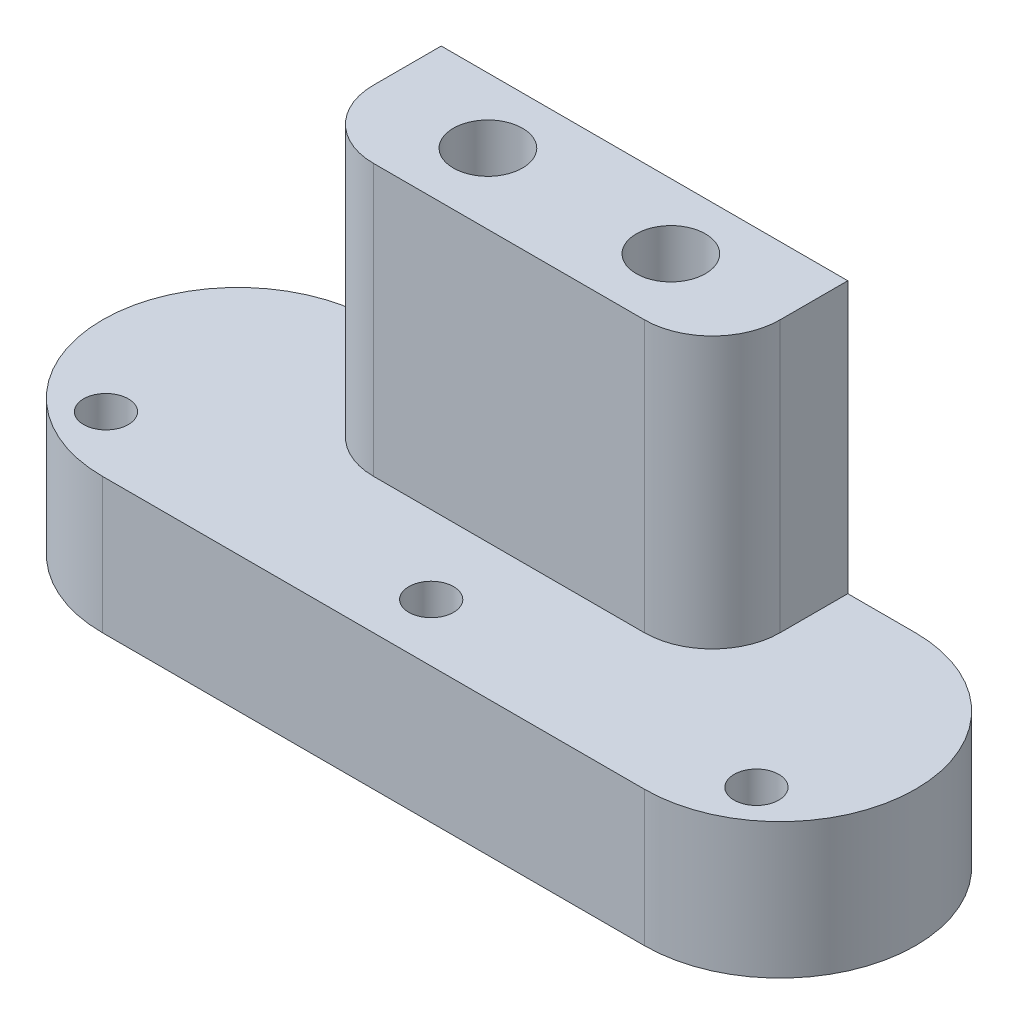
ISO-10303-21;
HEADER;
FILE_DESCRIPTION(('STEP AP214'),'2;1');
FILE_NAME('part.step','',(''),(''),'','','');
FILE_SCHEMA(('AUTOMOTIVE_DESIGN { 1 0 10303 214 1 1 1 1 }'));
ENDSEC;
DATA;
#1=APPLICATION_CONTEXT('core data for automotive mechanical design processes');
#2=APPLICATION_PROTOCOL_DEFINITION('international standard','automotive_design',2000,#1);
#3=PRODUCT_CONTEXT('',#1,'mechanical');
#4=PRODUCT('Part','Part','',(#3));
#5=PRODUCT_RELATED_PRODUCT_CATEGORY('part','',(#4));
#6=PRODUCT_DEFINITION_FORMATION('','',#4);
#7=PRODUCT_DEFINITION_CONTEXT('part definition',#1,'design');
#8=PRODUCT_DEFINITION('design','',#6,#7);
#9=PRODUCT_DEFINITION_SHAPE('','',#8);
#10=(LENGTH_UNIT() NAMED_UNIT(*) SI_UNIT(.MILLI.,.METRE.));
#11=(NAMED_UNIT(*) PLANE_ANGLE_UNIT() SI_UNIT($,.RADIAN.));
#12=(NAMED_UNIT(*) SI_UNIT($,.STERADIAN.) SOLID_ANGLE_UNIT());
#13=UNCERTAINTY_MEASURE_WITH_UNIT(LENGTH_MEASURE(1.E-05),#10,'distance_accuracy_value','');
#14=(GEOMETRIC_REPRESENTATION_CONTEXT(3) GLOBAL_UNCERTAINTY_ASSIGNED_CONTEXT((#13)) GLOBAL_UNIT_ASSIGNED_CONTEXT((#10,
#11,#12)) REPRESENTATION_CONTEXT('',''));
#15=CARTESIAN_POINT('',(0.,0.,0.));
#16=DIRECTION('',(0.,0.,1.));
#17=DIRECTION('',(1.,0.,0.));
#18=AXIS2_PLACEMENT_3D('',#15,#16,#17);
#19=CARTESIAN_POINT('',(-19.9999999999999,10.,0.));
#20=DIRECTION('',(0.,1.,0.));
#21=DIRECTION('',(0.,0.,1.));
#22=AXIS2_PLACEMENT_3D('',#19,#20,#21);
#23=PLANE('',#22);
#24=CARTESIAN_POINT('',(0.,10.,5.74115680757579));
#25=DIRECTION('',(0.,1.,0.));
#26=DIRECTION('',(0.,0.,1.));
#27=AXIS2_PLACEMENT_3D('',#24,#25,#26);
#28=CIRCLE('',#27,1.65);
#29=CARTESIAN_POINT('',(0.,10.,7.39115680757579));
#30=VERTEX_POINT('',#29);
#31=EDGE_CURVE('E157',#30,#30,#28,.T.);
#32=ORIENTED_EDGE('',*,*,#31,.F.);
#33=EDGE_LOOP('',(#32));
#34=FACE_BOUND('',#33,.T.);
#35=CARTESIAN_POINT('',(24.,10.,5.74115680757579));
#36=DIRECTION('',(0.,1.,0.));
#37=DIRECTION('',(0.,0.,1.));
#38=AXIS2_PLACEMENT_3D('',#35,#36,#37);
#39=CIRCLE('',#38,1.65);
#40=CARTESIAN_POINT('',(24.,10.,7.39115680757579));
#41=VERTEX_POINT('',#40);
#42=EDGE_CURVE('E165',#41,#41,#39,.T.);
#43=ORIENTED_EDGE('',*,*,#42,.F.);
#44=EDGE_LOOP('',(#43));
#45=FACE_BOUND('',#44,.T.);
#46=CARTESIAN_POINT('',(-24.,10.,5.74115680757579));
#47=DIRECTION('',(0.,1.,0.));
#48=DIRECTION('',(0.,0.,1.));
#49=AXIS2_PLACEMENT_3D('',#46,#47,#48);
#50=CIRCLE('',#49,1.65);
#51=CARTESIAN_POINT('',(-24.,10.,7.39115680757579));
#52=VERTEX_POINT('',#51);
#53=EDGE_CURVE('E171',#52,#52,#50,.T.);
#54=ORIENTED_EDGE('',*,*,#53,.F.);
#55=EDGE_LOOP('',(#54));
#56=FACE_BOUND('',#55,.T.);
#57=DIRECTION('',(1.,0.,0.));
#58=VECTOR('',#57,1.);
#59=CARTESIAN_POINT('',(-15.,10.,0.));
#60=LINE('',#59,#58);
#61=CARTESIAN_POINT('',(-10.,10.,0.));
#62=VERTEX_POINT('',#61);
#63=CARTESIAN_POINT('',(10.,10.,0.));
#64=VERTEX_POINT('',#63);
#65=EDGE_CURVE('E141',#62,#64,#60,.T.);
#66=ORIENTED_EDGE('',*,*,#65,.F.);
#67=CARTESIAN_POINT('',(-10.,10.,-5.));
#68=DIRECTION('',(0.,1.,0.));
#69=DIRECTION('',(0.,0.,1.));
#70=AXIS2_PLACEMENT_3D('',#67,#68,#69);
#71=CIRCLE('',#70,5.);
#72=CARTESIAN_POINT('',(-15.,10.,-5.));
#73=VERTEX_POINT('',#72);
#74=EDGE_CURVE('E43',#62,#73,#71,.F.);
#75=ORIENTED_EDGE('',*,*,#74,.T.);
#76=DIRECTION('',(0.,0.,-1.));
#77=VECTOR('',#76,1.);
#78=CARTESIAN_POINT('',(-15.,10.,0.));
#79=LINE('',#78,#77);
#80=CARTESIAN_POINT('',(-15.,10.,-10.));
#81=VERTEX_POINT('',#80);
#82=EDGE_CURVE('E137',#73,#81,#79,.T.);
#83=ORIENTED_EDGE('',*,*,#82,.T.);
#84=DIRECTION('',(-1.,0.,0.));
#85=VECTOR('',#84,1.);
#86=CARTESIAN_POINT('',(-19.9999999999999,10.,-10.));
#87=LINE('',#86,#85);
#88=CARTESIAN_POINT('',(-19.9999999999999,10.,-10.));
#89=VERTEX_POINT('',#88);
#90=EDGE_CURVE('E186',#81,#89,#87,.T.);
#91=ORIENTED_EDGE('',*,*,#90,.T.);
#92=CARTESIAN_POINT('',(-19.9999999999999,10.,0.));
#93=DIRECTION('',(0.,1.,0.));
#94=DIRECTION('',(0.,0.,1.));
#95=AXIS2_PLACEMENT_3D('',#92,#93,#94);
#96=CIRCLE('',#95,10.);
#97=CARTESIAN_POINT('',(-19.9999999999999,10.,10.));
#98=VERTEX_POINT('',#97);
#99=EDGE_CURVE('E178',#89,#98,#96,.T.);
#100=ORIENTED_EDGE('',*,*,#99,.T.);
#101=DIRECTION('',(1.,0.,0.));
#102=VECTOR('',#101,1.);
#103=CARTESIAN_POINT('',(-19.9999999999999,10.,10.));
#104=LINE('',#103,#102);
#105=CARTESIAN_POINT('',(20.,10.,10.));
#106=VERTEX_POINT('',#105);
#107=EDGE_CURVE('E181',#98,#106,#104,.T.);
#108=ORIENTED_EDGE('',*,*,#107,.T.);
#109=CARTESIAN_POINT('',(20.,10.,0.));
#110=DIRECTION('',(0.,1.,0.));
#111=DIRECTION('',(0.,0.,1.));
#112=AXIS2_PLACEMENT_3D('',#109,#110,#111);
#113=CIRCLE('',#112,10.);
#114=CARTESIAN_POINT('',(20.,10.,-10.));
#115=VERTEX_POINT('',#114);
#116=EDGE_CURVE('E184',#106,#115,#113,.T.);
#117=ORIENTED_EDGE('',*,*,#116,.T.);
#118=CARTESIAN_POINT('',(15.,10.,-10.));
#119=VERTEX_POINT('',#118);
#120=EDGE_CURVE('E187',#115,#119,#87,.T.);
#121=ORIENTED_EDGE('',*,*,#120,.T.);
#122=DIRECTION('',(0.,0.,-1.));
#123=VECTOR('',#122,1.);
#124=CARTESIAN_POINT('',(15.,10.,0.));
#125=LINE('',#124,#123);
#126=CARTESIAN_POINT('',(15.,10.,-5.));
#127=VERTEX_POINT('',#126);
#128=EDGE_CURVE('E150',#127,#119,#125,.T.);
#129=ORIENTED_EDGE('',*,*,#128,.F.);
#130=CARTESIAN_POINT('',(10.,10.,-5.));
#131=DIRECTION('',(0.,1.,0.));
#132=DIRECTION('',(0.,0.,1.));
#133=AXIS2_PLACEMENT_3D('',#130,#131,#132);
#134=CIRCLE('',#133,5.);
#135=EDGE_CURVE('E11',#127,#64,#134,.F.);
#136=ORIENTED_EDGE('',*,*,#135,.T.);
#137=EDGE_LOOP('',(#66,#75,#83,#91,#100,#108,#117,#121,#129,#136));
#138=FACE_BOUND('',#137,.T.);
#139=ADVANCED_FACE('F35',(#34,#45,#56,#138),#23,.T.);
#140=CARTESIAN_POINT('',(-19.9999999999999,10.,0.));
#141=DIRECTION('',(0.,-1.,0.));
#142=DIRECTION('',(0.,0.,-1.));
#143=AXIS2_PLACEMENT_3D('',#140,#141,#142);
#144=CYLINDRICAL_SURFACE('',#143,10.);
#145=CARTESIAN_POINT('',(-19.9999999999999,0.,0.));
#146=DIRECTION('',(0.,1.,0.));
#147=DIRECTION('',(0.,0.,1.));
#148=AXIS2_PLACEMENT_3D('',#145,#146,#147);
#149=CIRCLE('',#148,10.);
#150=CARTESIAN_POINT('',(-19.9999999999999,0.,-10.));
#151=VERTEX_POINT('',#150);
#152=CARTESIAN_POINT('',(-19.9999999999999,0.,10.));
#153=VERTEX_POINT('',#152);
#154=EDGE_CURVE('E177',#151,#153,#149,.T.);
#155=ORIENTED_EDGE('',*,*,#154,.T.);
#156=DIRECTION('',(0.,-1.,0.));
#157=VECTOR('',#156,1.);
#158=CARTESIAN_POINT('',(-19.9999999999999,10.,10.));
#159=LINE('',#158,#157);
#160=EDGE_CURVE('E206',#98,#153,#159,.T.);
#161=ORIENTED_EDGE('',*,*,#160,.F.);
#162=ORIENTED_EDGE('',*,*,#99,.F.);
#163=DIRECTION('',(0.,-1.,0.));
#164=VECTOR('',#163,1.);
#165=CARTESIAN_POINT('',(-19.9999999999999,10.,-10.));
#166=LINE('',#165,#164);
#167=EDGE_CURVE('E190',#89,#151,#166,.T.);
#168=ORIENTED_EDGE('',*,*,#167,.T.);
#169=EDGE_LOOP('',(#155,#161,#162,#168));
#170=FACE_BOUND('',#169,.T.);
#171=ADVANCED_FACE('F252',(#170),#144,.T.);
#172=CARTESIAN_POINT('',(-19.9999999999999,10.,10.));
#173=DIRECTION('',(0.,0.,-1.));
#174=DIRECTION('',(-1.,0.,0.));
#175=AXIS2_PLACEMENT_3D('',#172,#173,#174);
#176=PLANE('',#175);
#177=DIRECTION('',(1.,0.,0.));
#178=VECTOR('',#177,1.);
#179=CARTESIAN_POINT('',(-19.9999999999999,0.,10.));
#180=LINE('',#179,#178);
#181=CARTESIAN_POINT('',(20.,0.,10.));
#182=VERTEX_POINT('',#181);
#183=EDGE_CURVE('E193',#153,#182,#180,.T.);
#184=ORIENTED_EDGE('',*,*,#183,.T.);
#185=DIRECTION('',(0.,-1.,0.));
#186=VECTOR('',#185,1.);
#187=CARTESIAN_POINT('',(20.,10.,10.));
#188=LINE('',#187,#186);
#189=EDGE_CURVE('E203',#106,#182,#188,.T.);
#190=ORIENTED_EDGE('',*,*,#189,.F.);
#191=ORIENTED_EDGE('',*,*,#107,.F.);
#192=ORIENTED_EDGE('',*,*,#160,.T.);
#193=EDGE_LOOP('',(#184,#190,#191,#192));
#194=FACE_BOUND('',#193,.T.);
#195=ADVANCED_FACE('F255',(#194),#176,.F.);
#196=CARTESIAN_POINT('',(20.,10.,0.));
#197=DIRECTION('',(0.,-1.,0.));
#198=DIRECTION('',(0.,0.,-1.));
#199=AXIS2_PLACEMENT_3D('',#196,#197,#198);
#200=CYLINDRICAL_SURFACE('',#199,10.);
#201=CARTESIAN_POINT('',(20.,0.,0.));
#202=DIRECTION('',(0.,1.,0.));
#203=DIRECTION('',(0.,0.,1.));
#204=AXIS2_PLACEMENT_3D('',#201,#202,#203);
#205=CIRCLE('',#204,10.);
#206=CARTESIAN_POINT('',(20.,0.,-10.));
#207=VERTEX_POINT('',#206);
#208=EDGE_CURVE('E195',#182,#207,#205,.T.);
#209=ORIENTED_EDGE('',*,*,#208,.T.);
#210=DIRECTION('',(0.,-1.,0.));
#211=VECTOR('',#210,1.);
#212=CARTESIAN_POINT('',(20.,10.,-10.));
#213=LINE('',#212,#211);
#214=EDGE_CURVE('E200',#115,#207,#213,.T.);
#215=ORIENTED_EDGE('',*,*,#214,.F.);
#216=ORIENTED_EDGE('',*,*,#116,.F.);
#217=ORIENTED_EDGE('',*,*,#189,.T.);
#218=EDGE_LOOP('',(#209,#215,#216,#217));
#219=FACE_BOUND('',#218,.T.);
#220=ADVANCED_FACE('F258',(#219),#200,.T.);
#221=CARTESIAN_POINT('',(-19.9999999999999,10.,-10.));
#222=DIRECTION('',(0.,0.,1.));
#223=DIRECTION('',(1.,0.,0.));
#224=AXIS2_PLACEMENT_3D('',#221,#222,#223);
#225=PLANE('',#224);
#226=DIRECTION('',(-1.,0.,0.));
#227=VECTOR('',#226,1.);
#228=CARTESIAN_POINT('',(-19.9999999999999,0.,-10.));
#229=LINE('',#228,#227);
#230=EDGE_CURVE('E182',#207,#151,#229,.T.);
#231=ORIENTED_EDGE('',*,*,#230,.T.);
#232=ORIENTED_EDGE('',*,*,#167,.F.);
#233=ORIENTED_EDGE('',*,*,#90,.F.);
#234=DIRECTION('',(0.,-1.,0.));
#235=VECTOR('',#234,1.);
#236=CARTESIAN_POINT('',(-15.,30.,-10.));
#237=LINE('',#236,#235);
#238=CARTESIAN_POINT('',(-15.,30.,-10.));
#239=VERTEX_POINT('',#238);
#240=EDGE_CURVE('E148',#239,#81,#237,.T.);
#241=ORIENTED_EDGE('',*,*,#240,.F.);
#242=DIRECTION('',(1.,0.,0.));
#243=VECTOR('',#242,1.);
#244=CARTESIAN_POINT('',(-15.,30.,-10.));
#245=LINE('',#244,#243);
#246=CARTESIAN_POINT('',(15.,30.,-10.));
#247=VERTEX_POINT('',#246);
#248=EDGE_CURVE('E140',#239,#247,#245,.T.);
#249=ORIENTED_EDGE('',*,*,#248,.T.);
#250=DIRECTION('',(0.,-1.,0.));
#251=VECTOR('',#250,1.);
#252=CARTESIAN_POINT('',(15.,30.,-10.));
#253=LINE('',#252,#251);
#254=EDGE_CURVE('E154',#247,#119,#253,.T.);
#255=ORIENTED_EDGE('',*,*,#254,.T.);
#256=ORIENTED_EDGE('',*,*,#120,.F.);
#257=ORIENTED_EDGE('',*,*,#214,.T.);
#258=EDGE_LOOP('',(#231,#232,#233,#241,#249,#255,#256,#257));
#259=FACE_BOUND('',#258,.T.);
#260=ADVANCED_FACE('F246',(#259),#225,.F.);
#261=CARTESIAN_POINT('',(-19.9999999999999,0.,0.));
#262=DIRECTION('',(0.,1.,0.));
#263=DIRECTION('',(0.,0.,1.));
#264=AXIS2_PLACEMENT_3D('',#261,#262,#263);
#265=PLANE('',#264);
#266=CARTESIAN_POINT('',(0.,0.,5.74115680757579));
#267=DIRECTION('',(0.,1.,0.));
#268=DIRECTION('',(0.,0.,1.));
#269=AXIS2_PLACEMENT_3D('',#266,#267,#268);
#270=CIRCLE('',#269,1.65);
#271=CARTESIAN_POINT('',(0.,0.,7.39115680757579));
#272=VERTEX_POINT('',#271);
#273=EDGE_CURVE('E162',#272,#272,#270,.T.);
#274=ORIENTED_EDGE('',*,*,#273,.T.);
#275=EDGE_LOOP('',(#274));
#276=FACE_BOUND('',#275,.T.);
#277=CARTESIAN_POINT('',(24.,0.,5.74115680757579));
#278=DIRECTION('',(0.,1.,0.));
#279=DIRECTION('',(0.,0.,1.));
#280=AXIS2_PLACEMENT_3D('',#277,#278,#279);
#281=CIRCLE('',#280,1.65);
#282=CARTESIAN_POINT('',(24.,0.,7.39115680757579));
#283=VERTEX_POINT('',#282);
#284=EDGE_CURVE('E168',#283,#283,#281,.T.);
#285=ORIENTED_EDGE('',*,*,#284,.T.);
#286=EDGE_LOOP('',(#285));
#287=FACE_BOUND('',#286,.T.);
#288=CARTESIAN_POINT('',(-24.,0.,5.74115680757579));
#289=DIRECTION('',(0.,1.,0.));
#290=DIRECTION('',(0.,0.,1.));
#291=AXIS2_PLACEMENT_3D('',#288,#289,#290);
#292=CIRCLE('',#291,1.65);
#293=CARTESIAN_POINT('',(-24.,0.,7.39115680757579));
#294=VERTEX_POINT('',#293);
#295=EDGE_CURVE('E174',#294,#294,#292,.T.);
#296=ORIENTED_EDGE('',*,*,#295,.T.);
#297=EDGE_LOOP('',(#296));
#298=FACE_BOUND('',#297,.T.);
#299=ORIENTED_EDGE('',*,*,#154,.F.);
#300=ORIENTED_EDGE('',*,*,#230,.F.);
#301=ORIENTED_EDGE('',*,*,#208,.F.);
#302=ORIENTED_EDGE('',*,*,#183,.F.);
#303=EDGE_LOOP('',(#299,#300,#301,#302));
#304=FACE_BOUND('',#303,.T.);
#305=ADVANCED_FACE('F261',(#276,#287,#298,#304),#265,.F.);
#306=CARTESIAN_POINT('',(-24.,10.,5.74115680757579));
#307=DIRECTION('',(0.,1.,0.));
#308=DIRECTION('',(0.,0.,1.));
#309=AXIS2_PLACEMENT_3D('',#306,#307,#308);
#310=CYLINDRICAL_SURFACE('',#309,1.65);
#311=ORIENTED_EDGE('',*,*,#295,.F.);
#312=EDGE_LOOP('',(#311));
#313=FACE_BOUND('',#312,.T.);
#314=ORIENTED_EDGE('',*,*,#53,.T.);
#315=EDGE_LOOP('',(#314));
#316=FACE_BOUND('',#315,.T.);
#317=ADVANCED_FACE('F263',(#313,#316),#310,.F.);
#318=CARTESIAN_POINT('',(24.,10.,5.74115680757579));
#319=DIRECTION('',(0.,1.,0.));
#320=DIRECTION('',(0.,0.,1.));
#321=AXIS2_PLACEMENT_3D('',#318,#319,#320);
#322=CYLINDRICAL_SURFACE('',#321,1.65);
#323=ORIENTED_EDGE('',*,*,#284,.F.);
#324=EDGE_LOOP('',(#323));
#325=FACE_BOUND('',#324,.T.);
#326=ORIENTED_EDGE('',*,*,#42,.T.);
#327=EDGE_LOOP('',(#326));
#328=FACE_BOUND('',#327,.T.);
#329=ADVANCED_FACE('F270',(#325,#328),#322,.F.);
#330=CARTESIAN_POINT('',(0.,10.,5.74115680757579));
#331=DIRECTION('',(0.,1.,0.));
#332=DIRECTION('',(0.,0.,1.));
#333=AXIS2_PLACEMENT_3D('',#330,#331,#332);
#334=CYLINDRICAL_SURFACE('',#333,1.65);
#335=ORIENTED_EDGE('',*,*,#273,.F.);
#336=EDGE_LOOP('',(#335));
#337=FACE_BOUND('',#336,.T.);
#338=ORIENTED_EDGE('',*,*,#31,.T.);
#339=EDGE_LOOP('',(#338));
#340=FACE_BOUND('',#339,.T.);
#341=ADVANCED_FACE('F287',(#337,#340),#334,.F.);
#342=CARTESIAN_POINT('',(-15.,30.,0.));
#343=DIRECTION('',(-1.,0.,0.));
#344=DIRECTION('',(0.,0.,1.));
#345=AXIS2_PLACEMENT_3D('',#342,#343,#344);
#346=PLANE('',#345);
#347=ORIENTED_EDGE('',*,*,#82,.F.);
#348=DIRECTION('',(0.,-1.,0.));
#349=VECTOR('',#348,1.);
#350=CARTESIAN_POINT('',(-15.,30.,-5.));
#351=LINE('',#350,#349);
#352=CARTESIAN_POINT('',(-15.,30.,-5.));
#353=VERTEX_POINT('',#352);
#354=EDGE_CURVE('E214',#73,#353,#351,.F.);
#355=ORIENTED_EDGE('',*,*,#354,.T.);
#356=DIRECTION('',(0.,0.,-1.));
#357=VECTOR('',#356,1.);
#358=CARTESIAN_POINT('',(-15.,30.,0.));
#359=LINE('',#358,#357);
#360=EDGE_CURVE('E138',#353,#239,#359,.T.);
#361=ORIENTED_EDGE('',*,*,#360,.T.);
#362=ORIENTED_EDGE('',*,*,#240,.T.);
#363=EDGE_LOOP('',(#347,#355,#361,#362));
#364=FACE_BOUND('',#363,.T.);
#365=ADVANCED_FACE('F228',(#364),#346,.T.);
#366=CARTESIAN_POINT('',(-15.,30.,0.));
#367=DIRECTION('',(0.,0.,-1.));
#368=DIRECTION('',(-1.,0.,0.));
#369=AXIS2_PLACEMENT_3D('',#366,#367,#368);
#370=PLANE('',#369);
#371=DIRECTION('',(1.,0.,0.));
#372=VECTOR('',#371,1.);
#373=CARTESIAN_POINT('',(-15.,30.,0.));
#374=LINE('',#373,#372);
#375=CARTESIAN_POINT('',(-10.,30.,0.));
#376=VERTEX_POINT('',#375);
#377=CARTESIAN_POINT('',(10.,30.,0.));
#378=VERTEX_POINT('',#377);
#379=EDGE_CURVE('E146',#376,#378,#374,.T.);
#380=ORIENTED_EDGE('',*,*,#379,.F.);
#381=DIRECTION('',(0.,-1.,0.));
#382=VECTOR('',#381,1.);
#383=CARTESIAN_POINT('',(-10.,10.,0.));
#384=LINE('',#383,#382);
#385=EDGE_CURVE('E211',#376,#62,#384,.T.);
#386=ORIENTED_EDGE('',*,*,#385,.T.);
#387=ORIENTED_EDGE('',*,*,#65,.T.);
#388=DIRECTION('',(0.,-1.,0.));
#389=VECTOR('',#388,1.);
#390=CARTESIAN_POINT('',(10.,30.,0.));
#391=LINE('',#390,#389);
#392=EDGE_CURVE('E209',#64,#378,#391,.F.);
#393=ORIENTED_EDGE('',*,*,#392,.T.);
#394=EDGE_LOOP('',(#380,#386,#387,#393));
#395=FACE_BOUND('',#394,.T.);
#396=ADVANCED_FACE('F237',(#395),#370,.F.);
#397=CARTESIAN_POINT('',(15.,30.,0.));
#398=DIRECTION('',(-1.,0.,0.));
#399=DIRECTION('',(0.,0.,1.));
#400=AXIS2_PLACEMENT_3D('',#397,#398,#399);
#401=PLANE('',#400);
#402=DIRECTION('',(0.,0.,-1.));
#403=VECTOR('',#402,1.);
#404=CARTESIAN_POINT('',(15.,30.,0.));
#405=LINE('',#404,#403);
#406=CARTESIAN_POINT('',(15.,30.,-5.));
#407=VERTEX_POINT('',#406);
#408=EDGE_CURVE('E144',#407,#247,#405,.T.);
#409=ORIENTED_EDGE('',*,*,#408,.F.);
#410=DIRECTION('',(0.,-1.,0.));
#411=VECTOR('',#410,1.);
#412=CARTESIAN_POINT('',(15.,30.,-5.));
#413=LINE('',#412,#411);
#414=EDGE_CURVE('E219',#407,#127,#413,.T.);
#415=ORIENTED_EDGE('',*,*,#414,.T.);
#416=ORIENTED_EDGE('',*,*,#128,.T.);
#417=ORIENTED_EDGE('',*,*,#254,.F.);
#418=EDGE_LOOP('',(#409,#415,#416,#417));
#419=FACE_BOUND('',#418,.T.);
#420=ADVANCED_FACE('F240',(#419),#401,.F.);
#421=CARTESIAN_POINT('',(0.,30.,0.));
#422=DIRECTION('',(0.,-1.,0.));
#423=DIRECTION('',(0.,0.,-1.));
#424=AXIS2_PLACEMENT_3D('',#421,#422,#423);
#425=PLANE('',#424);
#426=CARTESIAN_POINT('',(-6.75,30.,-5.19437996875919));
#427=DIRECTION('',(0.,1.,0.));
#428=DIRECTION('',(0.,0.,1.));
#429=AXIS2_PLACEMENT_3D('',#426,#427,#428);
#430=CIRCLE('',#429,2.55);
#431=CARTESIAN_POINT('',(-6.75,30.,-2.64437996875919));
#432=VERTEX_POINT('',#431);
#433=EDGE_CURVE('E127',#432,#432,#430,.T.);
#434=ORIENTED_EDGE('',*,*,#433,.F.);
#435=EDGE_LOOP('',(#434));
#436=FACE_BOUND('',#435,.T.);
#437=CARTESIAN_POINT('',(6.75,30.,-5.19437996875919));
#438=DIRECTION('',(0.,1.,0.));
#439=DIRECTION('',(0.,0.,1.));
#440=AXIS2_PLACEMENT_3D('',#437,#438,#439);
#441=CIRCLE('',#440,2.55);
#442=CARTESIAN_POINT('',(6.75,30.,-2.64437996875919));
#443=VERTEX_POINT('',#442);
#444=EDGE_CURVE('E126',#443,#443,#441,.T.);
#445=ORIENTED_EDGE('',*,*,#444,.F.);
#446=EDGE_LOOP('',(#445));
#447=FACE_BOUND('',#446,.T.);
#448=ORIENTED_EDGE('',*,*,#360,.F.);
#449=CARTESIAN_POINT('',(-10.,30.,-5.));
#450=DIRECTION('',(0.,-1.,0.));
#451=DIRECTION('',(0.,0.,-1.));
#452=AXIS2_PLACEMENT_3D('',#449,#450,#451);
#453=CIRCLE('',#452,5.);
#454=EDGE_CURVE('E217',#353,#376,#453,.F.);
#455=ORIENTED_EDGE('',*,*,#454,.T.);
#456=ORIENTED_EDGE('',*,*,#379,.T.);
#457=CARTESIAN_POINT('',(10.,30.,-5.));
#458=DIRECTION('',(0.,-1.,0.));
#459=DIRECTION('',(0.,0.,-1.));
#460=AXIS2_PLACEMENT_3D('',#457,#458,#459);
#461=CIRCLE('',#460,5.);
#462=EDGE_CURVE('E56',#378,#407,#461,.F.);
#463=ORIENTED_EDGE('',*,*,#462,.T.);
#464=ORIENTED_EDGE('',*,*,#408,.T.);
#465=ORIENTED_EDGE('',*,*,#248,.F.);
#466=EDGE_LOOP('',(#448,#455,#456,#463,#464,#465));
#467=FACE_BOUND('',#466,.T.);
#468=ADVANCED_FACE('F234',(#436,#447,#467),#425,.F.);
#469=CARTESIAN_POINT('',(-10.,30.,-5.));
#470=DIRECTION('',(0.,1.,0.));
#471=DIRECTION('',(0.,0.,1.));
#472=AXIS2_PLACEMENT_3D('',#469,#470,#471);
#473=CYLINDRICAL_SURFACE('',#472,5.);
#474=ORIENTED_EDGE('',*,*,#454,.F.);
#475=ORIENTED_EDGE('',*,*,#354,.F.);
#476=ORIENTED_EDGE('',*,*,#74,.F.);
#477=ORIENTED_EDGE('',*,*,#385,.F.);
#478=EDGE_LOOP('',(#474,#475,#476,#477));
#479=FACE_BOUND('',#478,.T.);
#480=ADVANCED_FACE('F232',(#479),#473,.T.);
#481=CARTESIAN_POINT('',(10.,30.,-5.));
#482=DIRECTION('',(0.,-1.,0.));
#483=DIRECTION('',(0.,0.,-1.));
#484=AXIS2_PLACEMENT_3D('',#481,#482,#483);
#485=CYLINDRICAL_SURFACE('',#484,5.);
#486=ORIENTED_EDGE('',*,*,#462,.F.);
#487=ORIENTED_EDGE('',*,*,#392,.F.);
#488=ORIENTED_EDGE('',*,*,#135,.F.);
#489=ORIENTED_EDGE('',*,*,#414,.F.);
#490=EDGE_LOOP('',(#486,#487,#488,#489));
#491=FACE_BOUND('',#490,.T.);
#492=ADVANCED_FACE('F37',(#491),#485,.T.);
#493=CARTESIAN_POINT('',(6.75,26.2,-5.19437996875919));
#494=DIRECTION('',(0.,1.,0.));
#495=DIRECTION('',(0.,0.,1.));
#496=AXIS2_PLACEMENT_3D('',#493,#494,#495);
#497=CONICAL_SURFACE('',#496,2.55,0.785398163397448);
#498=CARTESIAN_POINT('',(6.75,23.65,-5.19437996875919));
#499=VERTEX_POINT('',#498);
#500=VERTEX_LOOP('',#499);
#501=FACE_BOUND('',#500,.T.);
#502=CARTESIAN_POINT('',(6.75,26.2,-5.19437996875919));
#503=DIRECTION('',(0.,1.,0.));
#504=DIRECTION('',(0.,0.,1.));
#505=AXIS2_PLACEMENT_3D('',#502,#503,#504);
#506=CIRCLE('',#505,2.55);
#507=CARTESIAN_POINT('',(6.75,26.2,-2.64437996875919));
#508=VERTEX_POINT('',#507);
#509=EDGE_CURVE('E130',#508,#508,#506,.T.);
#510=ORIENTED_EDGE('',*,*,#509,.T.);
#511=EDGE_LOOP('',(#510));
#512=FACE_BOUND('',#511,.T.);
#513=ADVANCED_FACE('F301',(#501,#512),#497,.F.);
#514=CARTESIAN_POINT('',(6.75,30.,-5.19437996875919));
#515=DIRECTION('',(0.,1.,0.));
#516=DIRECTION('',(0.,0.,1.));
#517=AXIS2_PLACEMENT_3D('',#514,#515,#516);
#518=CYLINDRICAL_SURFACE('',#517,2.55);
#519=ORIENTED_EDGE('',*,*,#509,.F.);
#520=EDGE_LOOP('',(#519));
#521=FACE_BOUND('',#520,.T.);
#522=ORIENTED_EDGE('',*,*,#444,.T.);
#523=EDGE_LOOP('',(#522));
#524=FACE_BOUND('',#523,.T.);
#525=ADVANCED_FACE('F120',(#521,#524),#518,.F.);
#526=CARTESIAN_POINT('',(-6.75,26.2,-5.19437996875919));
#527=DIRECTION('',(0.,1.,0.));
#528=DIRECTION('',(0.,0.,1.));
#529=AXIS2_PLACEMENT_3D('',#526,#527,#528);
#530=CONICAL_SURFACE('',#529,2.55,0.785398163397448);
#531=CARTESIAN_POINT('',(-6.75,23.65,-5.19437996875919));
#532=VERTEX_POINT('',#531);
#533=VERTEX_LOOP('',#532);
#534=FACE_BOUND('',#533,.T.);
#535=CARTESIAN_POINT('',(-6.75,26.2,-5.19437996875919));
#536=DIRECTION('',(0.,1.,0.));
#537=DIRECTION('',(0.,0.,1.));
#538=AXIS2_PLACEMENT_3D('',#535,#536,#537);
#539=CIRCLE('',#538,2.55);
#540=CARTESIAN_POINT('',(-6.75,26.2,-2.6443799687592));
#541=VERTEX_POINT('',#540);
#542=EDGE_CURVE('E124',#541,#541,#539,.T.);
#543=ORIENTED_EDGE('',*,*,#542,.T.);
#544=EDGE_LOOP('',(#543));
#545=FACE_BOUND('',#544,.T.);
#546=ADVANCED_FACE('F116',(#534,#545),#530,.F.);
#547=CARTESIAN_POINT('',(-6.75,30.,-5.19437996875919));
#548=DIRECTION('',(0.,1.,0.));
#549=DIRECTION('',(0.,0.,1.));
#550=AXIS2_PLACEMENT_3D('',#547,#548,#549);
#551=CYLINDRICAL_SURFACE('',#550,2.55);
#552=ORIENTED_EDGE('',*,*,#542,.F.);
#553=EDGE_LOOP('',(#552));
#554=FACE_BOUND('',#553,.T.);
#555=ORIENTED_EDGE('',*,*,#433,.T.);
#556=EDGE_LOOP('',(#555));
#557=FACE_BOUND('',#556,.T.);
#558=ADVANCED_FACE('F119',(#554,#557),#551,.F.);
#559=CLOSED_SHELL('',(#139,#171,#195,#220,#260,#305,#317,#329,#341,#365,#396,#420,#468,#480,
#492,#513,#525,#546,#558));
#560=MANIFOLD_SOLID_BREP('B2',#559);
#561=ADVANCED_BREP_SHAPE_REPRESENTATION('',(#18,#560),#14);
#562=SHAPE_DEFINITION_REPRESENTATION(#9,#561);
ENDSEC;
END-ISO-10303-21;
